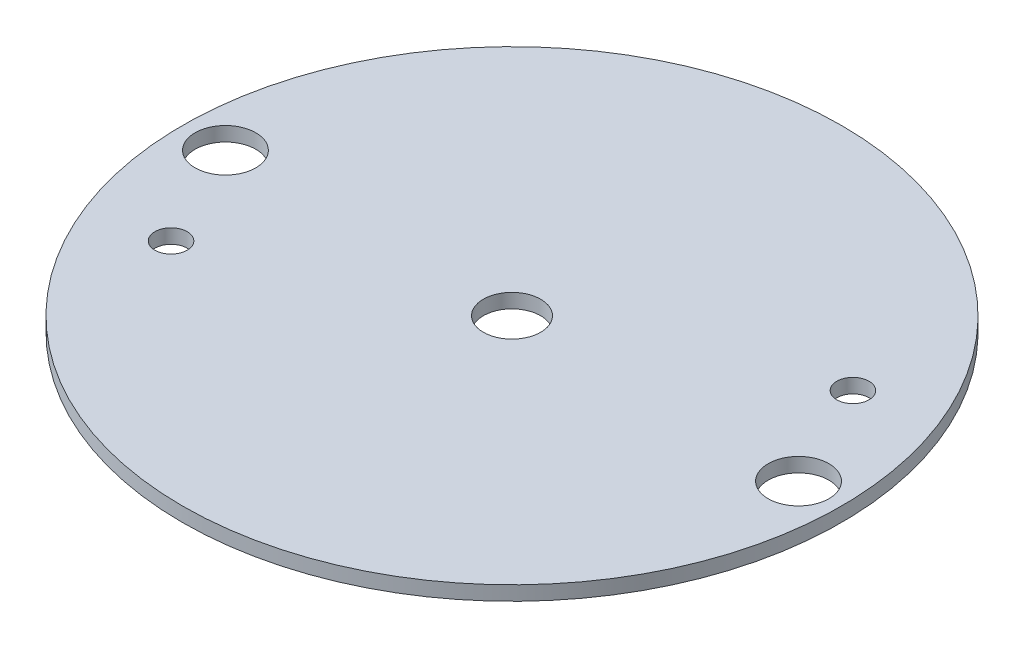
ISO-10303-21;
HEADER;
FILE_DESCRIPTION(('STEP AP214'),'2;1');
FILE_NAME('part.step','',(''),(''),'','','');
FILE_SCHEMA(('AUTOMOTIVE_DESIGN { 1 0 10303 214 1 1 1 1 }'));
ENDSEC;
DATA;
#1=APPLICATION_CONTEXT('core data for automotive mechanical design processes');
#2=APPLICATION_PROTOCOL_DEFINITION('international standard','automotive_design',2000,#1);
#3=PRODUCT_CONTEXT('',#1,'mechanical');
#4=PRODUCT('Part','Part','',(#3));
#5=PRODUCT_RELATED_PRODUCT_CATEGORY('part','',(#4));
#6=PRODUCT_DEFINITION_FORMATION('','',#4);
#7=PRODUCT_DEFINITION_CONTEXT('part definition',#1,'design');
#8=PRODUCT_DEFINITION('design','',#6,#7);
#9=PRODUCT_DEFINITION_SHAPE('','',#8);
#10=(LENGTH_UNIT() NAMED_UNIT(*) SI_UNIT(.MILLI.,.METRE.));
#11=(NAMED_UNIT(*) PLANE_ANGLE_UNIT() SI_UNIT($,.RADIAN.));
#12=(NAMED_UNIT(*) SI_UNIT($,.STERADIAN.) SOLID_ANGLE_UNIT());
#13=UNCERTAINTY_MEASURE_WITH_UNIT(LENGTH_MEASURE(1.E-05),#10,'distance_accuracy_value','');
#14=(GEOMETRIC_REPRESENTATION_CONTEXT(3) GLOBAL_UNCERTAINTY_ASSIGNED_CONTEXT((#13)) GLOBAL_UNIT_ASSIGNED_CONTEXT((#10,
#11,#12)) REPRESENTATION_CONTEXT('',''));
#15=CARTESIAN_POINT('',(0.,0.,0.));
#16=DIRECTION('',(0.,0.,1.));
#17=DIRECTION('',(1.,0.,0.));
#18=AXIS2_PLACEMENT_3D('',#15,#16,#17);
#19=CARTESIAN_POINT('',(0.,3.175,0.));
#20=DIRECTION('',(0.,-1.,0.));
#21=DIRECTION('',(0.,0.,-1.));
#22=AXIS2_PLACEMENT_3D('',#19,#20,#21);
#23=CYLINDRICAL_SURFACE('',#22,73.029292346);
#24=CARTESIAN_POINT('',(0.,3.175,0.));
#25=DIRECTION('',(0.,1.,0.));
#26=DIRECTION('',(0.,0.,1.));
#27=AXIS2_PLACEMENT_3D('',#24,#25,#26);
#28=CIRCLE('',#27,73.029292346);
#29=CARTESIAN_POINT('',(0.,3.175,73.029292346));
#30=VERTEX_POINT('',#29);
#31=EDGE_CURVE('E10',#30,#30,#28,.T.);
#32=ORIENTED_EDGE('',*,*,#31,.F.);
#33=EDGE_LOOP('',(#32));
#34=FACE_BOUND('',#33,.T.);
#35=CARTESIAN_POINT('',(0.,0.,0.));
#36=DIRECTION('',(0.,1.,0.));
#37=DIRECTION('',(0.,0.,1.));
#38=AXIS2_PLACEMENT_3D('',#35,#36,#37);
#39=CIRCLE('',#38,73.029292346);
#40=CARTESIAN_POINT('',(0.,0.,73.029292346));
#41=VERTEX_POINT('',#40);
#42=EDGE_CURVE('E50',#41,#41,#39,.T.);
#43=ORIENTED_EDGE('',*,*,#42,.T.);
#44=EDGE_LOOP('',(#43));
#45=FACE_BOUND('',#44,.T.);
#46=ADVANCED_FACE('F42',(#34,#45),#23,.T.);
#47=CARTESIAN_POINT('',(0.,3.175,0.));
#48=DIRECTION('',(0.,1.,0.));
#49=DIRECTION('',(0.,0.,1.));
#50=AXIS2_PLACEMENT_3D('',#47,#48,#49);
#51=PLANE('',#50);
#52=CARTESIAN_POINT('',(-52.1286533835542,3.175,23.4249012040022));
#53=DIRECTION('',(0.,1.,0.));
#54=DIRECTION('',(0.,0.,1.));
#55=AXIS2_PLACEMENT_3D('',#52,#53,#54);
#56=CIRCLE('',#55,3.571875);
#57=CARTESIAN_POINT('',(-52.1286533835542,3.175,26.9967762040022));
#58=VERTEX_POINT('',#57);
#59=EDGE_CURVE('E76',#58,#58,#56,.T.);
#60=ORIENTED_EDGE('',*,*,#59,.F.);
#61=EDGE_LOOP('',(#60));
#62=FACE_BOUND('',#61,.T.);
#63=CARTESIAN_POINT('',(52.1286533835542,3.175,-23.4249012040022));
#64=DIRECTION('',(0.,1.,0.));
#65=DIRECTION('',(0.,0.,1.));
#66=AXIS2_PLACEMENT_3D('',#63,#64,#65);
#67=CIRCLE('',#66,3.571875);
#68=CARTESIAN_POINT('',(52.1286533835542,3.175,-19.8530262040022));
#69=VERTEX_POINT('',#68);
#70=EDGE_CURVE('E84',#69,#69,#67,.T.);
#71=ORIENTED_EDGE('',*,*,#70,.F.);
#72=EDGE_LOOP('',(#71));
#73=FACE_BOUND('',#72,.T.);
#74=CARTESIAN_POINT('',(-63.5,3.175,0.));
#75=DIRECTION('',(0.,1.,0.));
#76=DIRECTION('',(0.,0.,1.));
#77=AXIS2_PLACEMENT_3D('',#74,#75,#76);
#78=CIRCLE('',#77,6.731);
#79=CARTESIAN_POINT('',(-63.5,3.175,6.73100000000001));
#80=VERTEX_POINT('',#79);
#81=EDGE_CURVE('E70',#80,#80,#78,.T.);
#82=ORIENTED_EDGE('',*,*,#81,.F.);
#83=EDGE_LOOP('',(#82));
#84=FACE_BOUND('',#83,.T.);
#85=CARTESIAN_POINT('',(63.5,3.175,0.));
#86=DIRECTION('',(0.,1.,0.));
#87=DIRECTION('',(0.,0.,1.));
#88=AXIS2_PLACEMENT_3D('',#85,#86,#87);
#89=CIRCLE('',#88,6.731);
#90=CARTESIAN_POINT('',(63.5,3.175,6.73099999999997));
#91=VERTEX_POINT('',#90);
#92=EDGE_CURVE('E82',#91,#91,#89,.T.);
#93=ORIENTED_EDGE('',*,*,#92,.F.);
#94=EDGE_LOOP('',(#93));
#95=FACE_BOUND('',#94,.T.);
#96=CARTESIAN_POINT('',(0.,3.175,0.));
#97=DIRECTION('',(0.,1.,0.));
#98=DIRECTION('',(0.,0.,1.));
#99=AXIS2_PLACEMENT_3D('',#96,#97,#98);
#100=CIRCLE('',#99,6.35);
#101=CARTESIAN_POINT('',(0.,3.175,6.35));
#102=VERTEX_POINT('',#101);
#103=EDGE_CURVE('E59',#102,#102,#100,.T.);
#104=ORIENTED_EDGE('',*,*,#103,.F.);
#105=EDGE_LOOP('',(#104));
#106=FACE_BOUND('',#105,.T.);
#107=ORIENTED_EDGE('',*,*,#31,.T.);
#108=EDGE_LOOP('',(#107));
#109=FACE_BOUND('',#108,.T.);
#110=ADVANCED_FACE('F101',(#62,#73,#84,#95,#106,#109),#51,.T.);
#111=CARTESIAN_POINT('',(0.,0.,0.));
#112=DIRECTION('',(0.,1.,0.));
#113=DIRECTION('',(0.,0.,1.));
#114=AXIS2_PLACEMENT_3D('',#111,#112,#113);
#115=PLANE('',#114);
#116=CARTESIAN_POINT('',(-52.1286533835542,0.,23.4249012040022));
#117=DIRECTION('',(0.,1.,0.));
#118=DIRECTION('',(0.,0.,1.));
#119=AXIS2_PLACEMENT_3D('',#116,#117,#118);
#120=CIRCLE('',#119,3.571875);
#121=CARTESIAN_POINT('',(-52.1286533835542,0.,26.9967762040022));
#122=VERTEX_POINT('',#121);
#123=EDGE_CURVE('E45',#122,#122,#120,.T.);
#124=ORIENTED_EDGE('',*,*,#123,.T.);
#125=EDGE_LOOP('',(#124));
#126=FACE_BOUND('',#125,.T.);
#127=CARTESIAN_POINT('',(52.1286533835542,0.,-23.4249012040022));
#128=DIRECTION('',(0.,1.,0.));
#129=DIRECTION('',(0.,0.,1.));
#130=AXIS2_PLACEMENT_3D('',#127,#128,#129);
#131=CIRCLE('',#130,3.571875);
#132=CARTESIAN_POINT('',(52.1286533835542,0.,-19.8530262040022));
#133=VERTEX_POINT('',#132);
#134=EDGE_CURVE('E73',#133,#133,#131,.T.);
#135=ORIENTED_EDGE('',*,*,#134,.T.);
#136=EDGE_LOOP('',(#135));
#137=FACE_BOUND('',#136,.T.);
#138=CARTESIAN_POINT('',(-63.5,0.,0.));
#139=DIRECTION('',(0.,1.,0.));
#140=DIRECTION('',(0.,0.,1.));
#141=AXIS2_PLACEMENT_3D('',#138,#139,#140);
#142=CIRCLE('',#141,6.731);
#143=CARTESIAN_POINT('',(-63.5,0.,6.73100000000001));
#144=VERTEX_POINT('',#143);
#145=EDGE_CURVE('E69',#144,#144,#142,.T.);
#146=ORIENTED_EDGE('',*,*,#145,.T.);
#147=EDGE_LOOP('',(#146));
#148=FACE_BOUND('',#147,.T.);
#149=CARTESIAN_POINT('',(63.5,0.,0.));
#150=DIRECTION('',(0.,1.,0.));
#151=DIRECTION('',(0.,0.,1.));
#152=AXIS2_PLACEMENT_3D('',#149,#150,#151);
#153=CIRCLE('',#152,6.731);
#154=CARTESIAN_POINT('',(63.5,0.,6.73099999999997));
#155=VERTEX_POINT('',#154);
#156=EDGE_CURVE('E65',#155,#155,#153,.T.);
#157=ORIENTED_EDGE('',*,*,#156,.T.);
#158=EDGE_LOOP('',(#157));
#159=FACE_BOUND('',#158,.T.);
#160=CARTESIAN_POINT('',(0.,0.,0.));
#161=DIRECTION('',(0.,1.,0.));
#162=DIRECTION('',(0.,0.,1.));
#163=AXIS2_PLACEMENT_3D('',#160,#161,#162);
#164=CIRCLE('',#163,6.35);
#165=CARTESIAN_POINT('',(0.,0.,6.35));
#166=VERTEX_POINT('',#165);
#167=EDGE_CURVE('E56',#166,#166,#164,.T.);
#168=ORIENTED_EDGE('',*,*,#167,.T.);
#169=EDGE_LOOP('',(#168));
#170=FACE_BOUND('',#169,.T.);
#171=ORIENTED_EDGE('',*,*,#42,.F.);
#172=EDGE_LOOP('',(#171));
#173=FACE_BOUND('',#172,.T.);
#174=ADVANCED_FACE('F104',(#126,#137,#148,#159,#170,#173),#115,.F.);
#175=CARTESIAN_POINT('',(0.,-13.081,0.));
#176=DIRECTION('',(0.,1.,0.));
#177=DIRECTION('',(0.,0.,1.));
#178=AXIS2_PLACEMENT_3D('',#175,#176,#177);
#179=CYLINDRICAL_SURFACE('',#178,6.35);
#180=ORIENTED_EDGE('',*,*,#103,.T.);
#181=EDGE_LOOP('',(#180));
#182=FACE_BOUND('',#181,.T.);
#183=ORIENTED_EDGE('',*,*,#167,.F.);
#184=EDGE_LOOP('',(#183));
#185=FACE_BOUND('',#184,.T.);
#186=ADVANCED_FACE('F111',(#182,#185),#179,.F.);
#187=CARTESIAN_POINT('',(63.5,-22.225,0.));
#188=DIRECTION('',(0.,1.,0.));
#189=DIRECTION('',(0.,0.,1.));
#190=AXIS2_PLACEMENT_3D('',#187,#188,#189);
#191=CYLINDRICAL_SURFACE('',#190,6.731);
#192=ORIENTED_EDGE('',*,*,#92,.T.);
#193=EDGE_LOOP('',(#192));
#194=FACE_BOUND('',#193,.T.);
#195=ORIENTED_EDGE('',*,*,#156,.F.);
#196=EDGE_LOOP('',(#195));
#197=FACE_BOUND('',#196,.T.);
#198=ADVANCED_FACE('F98',(#194,#197),#191,.F.);
#199=CARTESIAN_POINT('',(-63.5,-22.225,0.));
#200=DIRECTION('',(0.,1.,0.));
#201=DIRECTION('',(0.,0.,1.));
#202=AXIS2_PLACEMENT_3D('',#199,#200,#201);
#203=CYLINDRICAL_SURFACE('',#202,6.731);
#204=ORIENTED_EDGE('',*,*,#81,.T.);
#205=EDGE_LOOP('',(#204));
#206=FACE_BOUND('',#205,.T.);
#207=ORIENTED_EDGE('',*,*,#145,.F.);
#208=EDGE_LOOP('',(#207));
#209=FACE_BOUND('',#208,.T.);
#210=ADVANCED_FACE('F140',(#206,#209),#203,.F.);
#211=CARTESIAN_POINT('',(52.1286533835542,-250.825,-23.4249012040022));
#212=DIRECTION('',(0.,1.,0.));
#213=DIRECTION('',(0.,0.,1.));
#214=AXIS2_PLACEMENT_3D('',#211,#212,#213);
#215=CYLINDRICAL_SURFACE('',#214,3.571875);
#216=ORIENTED_EDGE('',*,*,#70,.T.);
#217=EDGE_LOOP('',(#216));
#218=FACE_BOUND('',#217,.T.);
#219=ORIENTED_EDGE('',*,*,#134,.F.);
#220=EDGE_LOOP('',(#219));
#221=FACE_BOUND('',#220,.T.);
#222=ADVANCED_FACE('F147',(#218,#221),#215,.F.);
#223=CARTESIAN_POINT('',(-52.1286533835542,-250.825,23.4249012040022));
#224=DIRECTION('',(0.,1.,0.));
#225=DIRECTION('',(0.,0.,1.));
#226=AXIS2_PLACEMENT_3D('',#223,#224,#225);
#227=CYLINDRICAL_SURFACE('',#226,3.571875);
#228=ORIENTED_EDGE('',*,*,#59,.T.);
#229=EDGE_LOOP('',(#228));
#230=FACE_BOUND('',#229,.T.);
#231=ORIENTED_EDGE('',*,*,#123,.F.);
#232=EDGE_LOOP('',(#231));
#233=FACE_BOUND('',#232,.T.);
#234=ADVANCED_FACE('F165',(#230,#233),#227,.F.);
#235=CLOSED_SHELL('',(#46,#110,#174,#186,#198,#210,#222,#234));
#236=MANIFOLD_SOLID_BREP('B2',#235);
#237=ADVANCED_BREP_SHAPE_REPRESENTATION('',(#18,#236),#14);
#238=SHAPE_DEFINITION_REPRESENTATION(#9,#237);
ENDSEC;
END-ISO-10303-21;
